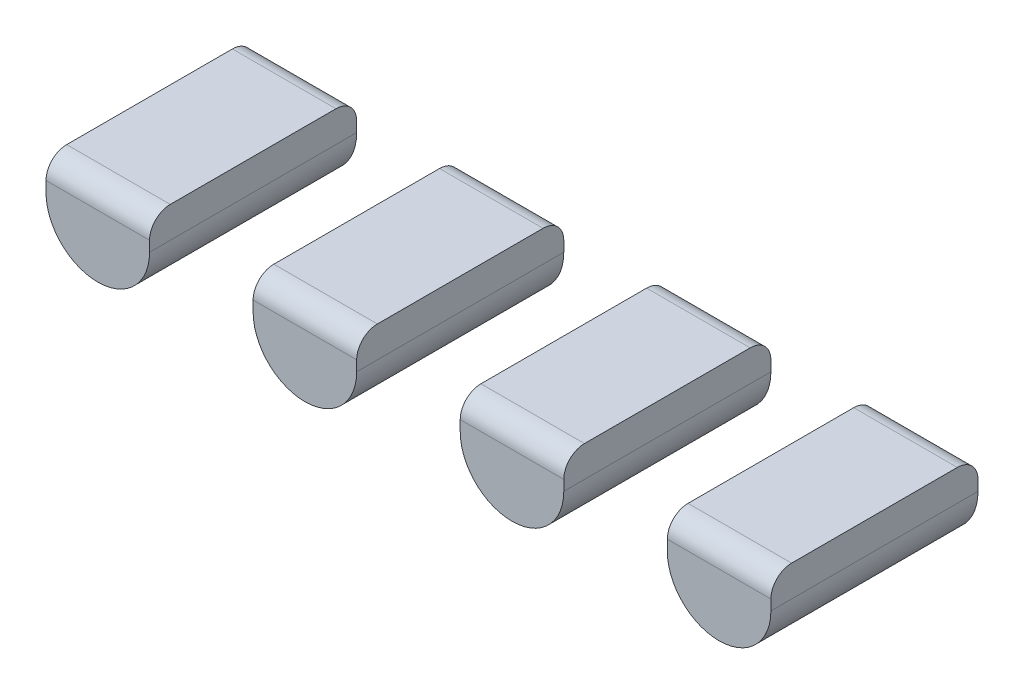
ISO-10303-21;
HEADER;
FILE_DESCRIPTION(('STEP AP214'),'2;1');
FILE_NAME('part.step','',(''),(''),'','','');
FILE_SCHEMA(('AUTOMOTIVE_DESIGN { 1 0 10303 214 1 1 1 1 }'));
ENDSEC;
DATA;
#1=APPLICATION_CONTEXT('core data for automotive mechanical design processes');
#2=APPLICATION_PROTOCOL_DEFINITION('international standard','automotive_design',2000,#1);
#3=PRODUCT_CONTEXT('',#1,'mechanical');
#4=PRODUCT('Part','Part','',(#3));
#5=PRODUCT_RELATED_PRODUCT_CATEGORY('part','',(#4));
#6=PRODUCT_DEFINITION_FORMATION('','',#4);
#7=PRODUCT_DEFINITION_CONTEXT('part definition',#1,'design');
#8=PRODUCT_DEFINITION('design','',#6,#7);
#9=PRODUCT_DEFINITION_SHAPE('','',#8);
#10=(LENGTH_UNIT() NAMED_UNIT(*) SI_UNIT(.MILLI.,.METRE.));
#11=(NAMED_UNIT(*) PLANE_ANGLE_UNIT() SI_UNIT($,.RADIAN.));
#12=(NAMED_UNIT(*) SI_UNIT($,.STERADIAN.) SOLID_ANGLE_UNIT());
#13=UNCERTAINTY_MEASURE_WITH_UNIT(LENGTH_MEASURE(1.E-05),#10,'distance_accuracy_value','');
#14=(GEOMETRIC_REPRESENTATION_CONTEXT(3) GLOBAL_UNCERTAINTY_ASSIGNED_CONTEXT((#13)) GLOBAL_UNIT_ASSIGNED_CONTEXT((#10,
#11,#12)) REPRESENTATION_CONTEXT('',''));
#15=CARTESIAN_POINT('',(0.,0.,0.));
#16=DIRECTION('',(0.,0.,1.));
#17=DIRECTION('',(1.,0.,0.));
#18=AXIS2_PLACEMENT_3D('',#15,#16,#17);
#19=CARTESIAN_POINT('',(0.125,0.51,0.));
#20=DIRECTION('',(0.,1.,0.));
#21=DIRECTION('',(-1.,0.,0.));
#22=AXIS2_PLACEMENT_3D('',#19,#20,#21);
#23=PLANE('',#22);
#24=DIRECTION('',(0.,0.,1.));
#25=VECTOR('',#24,1.);
#26=CARTESIAN_POINT('',(0.375,0.51,0.));
#27=LINE('',#26,#25);
#28=CARTESIAN_POINT('',(0.375,0.51,0.05));
#29=VERTEX_POINT('',#28);
#30=CARTESIAN_POINT('',(0.375,0.51,0.45));
#31=VERTEX_POINT('',#30);
#32=EDGE_CURVE('P0_E69',#29,#31,#27,.T.);
#33=ORIENTED_EDGE('',*,*,#32,.F.);
#34=DIRECTION('',(1.,0.,0.));
#35=VECTOR('',#34,1.);
#36=CARTESIAN_POINT('',(0.125,0.51,0.05));
#37=LINE('',#36,#35);
#38=CARTESIAN_POINT('',(0.125,0.51,0.05));
#39=VERTEX_POINT('',#38);
#40=EDGE_CURVE('P0_E77',#39,#29,#37,.T.);
#41=ORIENTED_EDGE('',*,*,#40,.F.);
#42=DIRECTION('',(0.,0.,1.));
#43=VECTOR('',#42,1.);
#44=CARTESIAN_POINT('',(0.125,0.51,0.));
#45=LINE('',#44,#43);
#46=CARTESIAN_POINT('',(0.125,0.51,0.45));
#47=VERTEX_POINT('',#46);
#48=EDGE_CURVE('P0_E72',#47,#39,#45,.F.);
#49=ORIENTED_EDGE('',*,*,#48,.F.);
#50=DIRECTION('',(1.,0.,0.));
#51=VECTOR('',#50,1.);
#52=CARTESIAN_POINT('',(0.125,0.51,0.45));
#53=LINE('',#52,#51);
#54=EDGE_CURVE('P0_E66',#31,#47,#53,.F.);
#55=ORIENTED_EDGE('',*,*,#54,.F.);
#56=EDGE_LOOP('',(#33,#41,#49,#55));
#57=FACE_BOUND('',#56,.T.);
#58=ADVANCED_FACE('P0_F17',(#57),#23,.T.);
#59=CARTESIAN_POINT('',(0.125,0.46,0.05));
#60=DIRECTION('',(1.,0.,0.));
#61=DIRECTION('',(0.,1.,0.));
#62=AXIS2_PLACEMENT_3D('',#59,#60,#61);
#63=CYLINDRICAL_SURFACE('',#62,0.05);
#64=DIRECTION('',(-1.,0.,0.));
#65=VECTOR('',#64,1.);
#66=CARTESIAN_POINT('',(0.125,0.46,0.));
#67=LINE('',#66,#65);
#68=CARTESIAN_POINT('',(0.125,0.46,0.));
#69=VERTEX_POINT('',#68);
#70=CARTESIAN_POINT('',(0.375,0.46,0.));
#71=VERTEX_POINT('',#70);
#72=EDGE_CURVE('P0_E76',#69,#71,#67,.F.);
#73=ORIENTED_EDGE('',*,*,#72,.F.);
#74=CARTESIAN_POINT('',(0.125,0.46,0.05));
#75=DIRECTION('',(1.,0.,0.));
#76=DIRECTION('',(0.,1.,0.));
#77=AXIS2_PLACEMENT_3D('',#74,#75,#76);
#78=CIRCLE('',#77,0.05);
#79=EDGE_CURVE('P0_E106',#39,#69,#78,.F.);
#80=ORIENTED_EDGE('',*,*,#79,.F.);
#81=ORIENTED_EDGE('',*,*,#40,.T.);
#82=CARTESIAN_POINT('',(0.375,0.46,0.05));
#83=DIRECTION('',(1.,0.,0.));
#84=DIRECTION('',(0.,1.,0.));
#85=AXIS2_PLACEMENT_3D('',#82,#83,#84);
#86=CIRCLE('',#85,0.05);
#87=EDGE_CURVE('P0_E90',#71,#29,#86,.T.);
#88=ORIENTED_EDGE('',*,*,#87,.F.);
#89=EDGE_LOOP('',(#73,#80,#81,#88));
#90=FACE_BOUND('',#89,.T.);
#91=ADVANCED_FACE('P0_F118',(#90),#63,.T.);
#92=CARTESIAN_POINT('',(0.125,0.46,0.45));
#93=DIRECTION('',(1.,0.,0.));
#94=DIRECTION('',(0.,1.,0.));
#95=AXIS2_PLACEMENT_3D('',#92,#93,#94);
#96=CYLINDRICAL_SURFACE('',#95,0.05);
#97=CARTESIAN_POINT('',(0.375,0.46,0.45));
#98=DIRECTION('',(1.,0.,0.));
#99=DIRECTION('',(0.,1.,0.));
#100=AXIS2_PLACEMENT_3D('',#97,#98,#99);
#101=CIRCLE('',#100,0.05);
#102=CARTESIAN_POINT('',(0.375,0.46,0.5));
#103=VERTEX_POINT('',#102);
#104=EDGE_CURVE('P0_E20',#31,#103,#101,.T.);
#105=ORIENTED_EDGE('',*,*,#104,.F.);
#106=ORIENTED_EDGE('',*,*,#54,.T.);
#107=CARTESIAN_POINT('',(0.125,0.46,0.45));
#108=DIRECTION('',(1.,0.,0.));
#109=DIRECTION('',(0.,1.,0.));
#110=AXIS2_PLACEMENT_3D('',#107,#108,#109);
#111=CIRCLE('',#110,0.05);
#112=CARTESIAN_POINT('',(0.125,0.46,0.5));
#113=VERTEX_POINT('',#112);
#114=EDGE_CURVE('P0_E104',#113,#47,#111,.F.);
#115=ORIENTED_EDGE('',*,*,#114,.F.);
#116=DIRECTION('',(-1.,0.,0.));
#117=VECTOR('',#116,1.);
#118=CARTESIAN_POINT('',(0.125,0.46,0.5));
#119=LINE('',#118,#117);
#120=EDGE_CURVE('P0_E82',#113,#103,#119,.F.);
#121=ORIENTED_EDGE('',*,*,#120,.T.);
#122=EDGE_LOOP('',(#105,#106,#115,#121));
#123=FACE_BOUND('',#122,.T.);
#124=ADVANCED_FACE('P0_F81',(#123),#96,.T.);
#125=CARTESIAN_POINT('',(0.125,0.435,0.));
#126=DIRECTION('',(0.,0.,-1.));
#127=DIRECTION('',(-1.,0.,0.));
#128=AXIS2_PLACEMENT_3D('',#125,#126,#127);
#129=PLANE('',#128);
#130=DIRECTION('',(0.,-1.,0.));
#131=VECTOR('',#130,1.);
#132=CARTESIAN_POINT('',(0.125,0.435,0.));
#133=LINE('',#132,#131);
#134=CARTESIAN_POINT('',(0.125,0.435,0.));
#135=VERTEX_POINT('',#134);
#136=EDGE_CURVE('P0_E108',#69,#135,#133,.T.);
#137=ORIENTED_EDGE('',*,*,#136,.F.);
#138=ORIENTED_EDGE('',*,*,#72,.T.);
#139=DIRECTION('',(0.,1.,0.));
#140=VECTOR('',#139,1.);
#141=CARTESIAN_POINT('',(0.375,0.51,0.));
#142=LINE('',#141,#140);
#143=CARTESIAN_POINT('',(0.375,0.435,0.));
#144=VERTEX_POINT('',#143);
#145=EDGE_CURVE('P0_E85',#144,#71,#142,.T.);
#146=ORIENTED_EDGE('',*,*,#145,.F.);
#147=CARTESIAN_POINT('',(0.25,0.435,0.));
#148=DIRECTION('',(0.,0.,-1.));
#149=DIRECTION('',(-1.,0.,0.));
#150=AXIS2_PLACEMENT_3D('',#147,#148,#149);
#151=CIRCLE('',#150,0.125);
#152=EDGE_CURVE('P0_E101',#135,#144,#151,.F.);
#153=ORIENTED_EDGE('',*,*,#152,.F.);
#154=EDGE_LOOP('',(#137,#138,#146,#153));
#155=FACE_BOUND('',#154,.T.);
#156=ADVANCED_FACE('P0_F114',(#155),#129,.T.);
#157=CARTESIAN_POINT('',(0.375,0.51,0.));
#158=DIRECTION('',(1.,0.,0.));
#159=DIRECTION('',(0.,1.,0.));
#160=AXIS2_PLACEMENT_3D('',#157,#158,#159);
#161=PLANE('',#160);
#162=ORIENTED_EDGE('',*,*,#145,.T.);
#163=ORIENTED_EDGE('',*,*,#87,.T.);
#164=ORIENTED_EDGE('',*,*,#32,.T.);
#165=ORIENTED_EDGE('',*,*,#104,.T.);
#166=DIRECTION('',(0.,1.,0.));
#167=VECTOR('',#166,1.);
#168=CARTESIAN_POINT('',(0.375,0.435,0.5));
#169=LINE('',#168,#167);
#170=CARTESIAN_POINT('',(0.375,0.435,0.5));
#171=VERTEX_POINT('',#170);
#172=EDGE_CURVE('P0_E95',#103,#171,#169,.F.);
#173=ORIENTED_EDGE('',*,*,#172,.T.);
#174=DIRECTION('',(0.,0.,-1.));
#175=VECTOR('',#174,1.);
#176=CARTESIAN_POINT('',(0.375,0.435,0.));
#177=LINE('',#176,#175);
#178=EDGE_CURVE('P0_E100',#144,#171,#177,.F.);
#179=ORIENTED_EDGE('',*,*,#178,.F.);
#180=EDGE_LOOP('',(#162,#163,#164,#165,#173,#179));
#181=FACE_BOUND('',#180,.T.);
#182=ADVANCED_FACE('P0_F88',(#181),#161,.T.);
#183=CARTESIAN_POINT('',(0.125,0.435,0.5));
#184=DIRECTION('',(0.,0.,-1.));
#185=DIRECTION('',(-1.,0.,0.));
#186=AXIS2_PLACEMENT_3D('',#183,#184,#185);
#187=PLANE('',#186);
#188=DIRECTION('',(0.,-1.,0.));
#189=VECTOR('',#188,1.);
#190=CARTESIAN_POINT('',(0.125,0.435,0.5));
#191=LINE('',#190,#189);
#192=CARTESIAN_POINT('',(0.125,0.435,0.5));
#193=VERTEX_POINT('',#192);
#194=EDGE_CURVE('P0_E35',#193,#113,#191,.F.);
#195=ORIENTED_EDGE('',*,*,#194,.F.);
#196=CARTESIAN_POINT('',(0.25,0.435,0.5));
#197=DIRECTION('',(0.,0.,-1.));
#198=DIRECTION('',(-1.,0.,0.));
#199=AXIS2_PLACEMENT_3D('',#196,#197,#198);
#200=CIRCLE('',#199,0.125);
#201=EDGE_CURVE('P0_E26',#171,#193,#200,.T.);
#202=ORIENTED_EDGE('',*,*,#201,.F.);
#203=ORIENTED_EDGE('',*,*,#172,.F.);
#204=ORIENTED_EDGE('',*,*,#120,.F.);
#205=EDGE_LOOP('',(#195,#202,#203,#204));
#206=FACE_BOUND('',#205,.T.);
#207=ADVANCED_FACE('P0_F127',(#206),#187,.F.);
#208=CARTESIAN_POINT('',(0.125,0.435,0.));
#209=DIRECTION('',(-1.,0.,0.));
#210=DIRECTION('',(0.,-1.,0.));
#211=AXIS2_PLACEMENT_3D('',#208,#209,#210);
#212=PLANE('',#211);
#213=ORIENTED_EDGE('',*,*,#194,.T.);
#214=ORIENTED_EDGE('',*,*,#114,.T.);
#215=ORIENTED_EDGE('',*,*,#48,.T.);
#216=ORIENTED_EDGE('',*,*,#79,.T.);
#217=ORIENTED_EDGE('',*,*,#136,.T.);
#218=DIRECTION('',(0.,0.,-1.));
#219=VECTOR('',#218,1.);
#220=CARTESIAN_POINT('',(0.125,0.435,0.));
#221=LINE('',#220,#219);
#222=EDGE_CURVE('P0_E11',#193,#135,#221,.T.);
#223=ORIENTED_EDGE('',*,*,#222,.F.);
#224=EDGE_LOOP('',(#213,#214,#215,#216,#217,#223));
#225=FACE_BOUND('',#224,.T.);
#226=ADVANCED_FACE('P0_F120',(#225),#212,.T.);
#227=CARTESIAN_POINT('',(0.25,0.435,0.));
#228=DIRECTION('',(0.,0.,-1.));
#229=DIRECTION('',(-1.,0.,0.));
#230=AXIS2_PLACEMENT_3D('',#227,#228,#229);
#231=CYLINDRICAL_SURFACE('',#230,0.125);
#232=ORIENTED_EDGE('',*,*,#201,.T.);
#233=ORIENTED_EDGE('',*,*,#222,.T.);
#234=ORIENTED_EDGE('',*,*,#152,.T.);
#235=ORIENTED_EDGE('',*,*,#178,.T.);
#236=EDGE_LOOP('',(#232,#233,#234,#235));
#237=FACE_BOUND('',#236,.T.);
#238=ADVANCED_FACE('P0_F126',(#237),#231,.T.);
#239=CLOSED_SHELL('',(#58,#91,#124,#156,#182,#207,#226,#238));
#240=MANIFOLD_SOLID_BREP('P0_B1',#239);
#241=CARTESIAN_POINT('',(-0.375,0.51,0.));
#242=DIRECTION('',(0.,1.,0.));
#243=DIRECTION('',(-1.,0.,0.));
#244=AXIS2_PLACEMENT_3D('',#241,#242,#243);
#245=PLANE('',#244);
#246=DIRECTION('',(0.,0.,1.));
#247=VECTOR('',#246,1.);
#248=CARTESIAN_POINT('',(-0.125,0.51,0.));
#249=LINE('',#248,#247);
#250=CARTESIAN_POINT('',(-0.125,0.51,0.05));
#251=VERTEX_POINT('',#250);
#252=CARTESIAN_POINT('',(-0.125,0.51,0.45));
#253=VERTEX_POINT('',#252);
#254=EDGE_CURVE('P1_E69',#251,#253,#249,.T.);
#255=ORIENTED_EDGE('',*,*,#254,.F.);
#256=DIRECTION('',(1.,0.,0.));
#257=VECTOR('',#256,1.);
#258=CARTESIAN_POINT('',(-0.375,0.51,0.05));
#259=LINE('',#258,#257);
#260=CARTESIAN_POINT('',(-0.375,0.51,0.05));
#261=VERTEX_POINT('',#260);
#262=EDGE_CURVE('P1_E77',#261,#251,#259,.T.);
#263=ORIENTED_EDGE('',*,*,#262,.F.);
#264=DIRECTION('',(0.,0.,1.));
#265=VECTOR('',#264,1.);
#266=CARTESIAN_POINT('',(-0.375,0.51,0.));
#267=LINE('',#266,#265);
#268=CARTESIAN_POINT('',(-0.375,0.51,0.45));
#269=VERTEX_POINT('',#268);
#270=EDGE_CURVE('P1_E72',#269,#261,#267,.F.);
#271=ORIENTED_EDGE('',*,*,#270,.F.);
#272=DIRECTION('',(1.,0.,0.));
#273=VECTOR('',#272,1.);
#274=CARTESIAN_POINT('',(-0.375,0.51,0.45));
#275=LINE('',#274,#273);
#276=EDGE_CURVE('P1_E66',#253,#269,#275,.F.);
#277=ORIENTED_EDGE('',*,*,#276,.F.);
#278=EDGE_LOOP('',(#255,#263,#271,#277));
#279=FACE_BOUND('',#278,.T.);
#280=ADVANCED_FACE('P1_F17',(#279),#245,.T.);
#281=CARTESIAN_POINT('',(-0.375,0.46,0.05));
#282=DIRECTION('',(1.,0.,0.));
#283=DIRECTION('',(0.,1.,0.));
#284=AXIS2_PLACEMENT_3D('',#281,#282,#283);
#285=CYLINDRICAL_SURFACE('',#284,0.05);
#286=DIRECTION('',(-1.,0.,0.));
#287=VECTOR('',#286,1.);
#288=CARTESIAN_POINT('',(-0.375,0.46,0.));
#289=LINE('',#288,#287);
#290=CARTESIAN_POINT('',(-0.375,0.46,0.));
#291=VERTEX_POINT('',#290);
#292=CARTESIAN_POINT('',(-0.125,0.46,0.));
#293=VERTEX_POINT('',#292);
#294=EDGE_CURVE('P1_E76',#291,#293,#289,.F.);
#295=ORIENTED_EDGE('',*,*,#294,.F.);
#296=CARTESIAN_POINT('',(-0.375,0.46,0.05));
#297=DIRECTION('',(1.,0.,0.));
#298=DIRECTION('',(0.,1.,0.));
#299=AXIS2_PLACEMENT_3D('',#296,#297,#298);
#300=CIRCLE('',#299,0.05);
#301=EDGE_CURVE('P1_E106',#261,#291,#300,.F.);
#302=ORIENTED_EDGE('',*,*,#301,.F.);
#303=ORIENTED_EDGE('',*,*,#262,.T.);
#304=CARTESIAN_POINT('',(-0.125,0.46,0.05));
#305=DIRECTION('',(1.,0.,0.));
#306=DIRECTION('',(0.,1.,0.));
#307=AXIS2_PLACEMENT_3D('',#304,#305,#306);
#308=CIRCLE('',#307,0.05);
#309=EDGE_CURVE('P1_E90',#293,#251,#308,.T.);
#310=ORIENTED_EDGE('',*,*,#309,.F.);
#311=EDGE_LOOP('',(#295,#302,#303,#310));
#312=FACE_BOUND('',#311,.T.);
#313=ADVANCED_FACE('P1_F118',(#312),#285,.T.);
#314=CARTESIAN_POINT('',(-0.375,0.46,0.45));
#315=DIRECTION('',(1.,0.,0.));
#316=DIRECTION('',(0.,1.,0.));
#317=AXIS2_PLACEMENT_3D('',#314,#315,#316);
#318=CYLINDRICAL_SURFACE('',#317,0.05);
#319=CARTESIAN_POINT('',(-0.125,0.46,0.45));
#320=DIRECTION('',(1.,0.,0.));
#321=DIRECTION('',(0.,1.,0.));
#322=AXIS2_PLACEMENT_3D('',#319,#320,#321);
#323=CIRCLE('',#322,0.05);
#324=CARTESIAN_POINT('',(-0.125,0.46,0.5));
#325=VERTEX_POINT('',#324);
#326=EDGE_CURVE('P1_E20',#253,#325,#323,.T.);
#327=ORIENTED_EDGE('',*,*,#326,.F.);
#328=ORIENTED_EDGE('',*,*,#276,.T.);
#329=CARTESIAN_POINT('',(-0.375,0.46,0.45));
#330=DIRECTION('',(1.,0.,0.));
#331=DIRECTION('',(0.,1.,0.));
#332=AXIS2_PLACEMENT_3D('',#329,#330,#331);
#333=CIRCLE('',#332,0.05);
#334=CARTESIAN_POINT('',(-0.375,0.46,0.5));
#335=VERTEX_POINT('',#334);
#336=EDGE_CURVE('P1_E104',#335,#269,#333,.F.);
#337=ORIENTED_EDGE('',*,*,#336,.F.);
#338=DIRECTION('',(-1.,0.,0.));
#339=VECTOR('',#338,1.);
#340=CARTESIAN_POINT('',(-0.375,0.46,0.5));
#341=LINE('',#340,#339);
#342=EDGE_CURVE('P1_E82',#335,#325,#341,.F.);
#343=ORIENTED_EDGE('',*,*,#342,.T.);
#344=EDGE_LOOP('',(#327,#328,#337,#343));
#345=FACE_BOUND('',#344,.T.);
#346=ADVANCED_FACE('P1_F81',(#345),#318,.T.);
#347=CARTESIAN_POINT('',(-0.375,0.435,0.));
#348=DIRECTION('',(0.,0.,-1.));
#349=DIRECTION('',(-1.,0.,0.));
#350=AXIS2_PLACEMENT_3D('',#347,#348,#349);
#351=PLANE('',#350);
#352=DIRECTION('',(0.,-1.,0.));
#353=VECTOR('',#352,1.);
#354=CARTESIAN_POINT('',(-0.375,0.435,0.));
#355=LINE('',#354,#353);
#356=CARTESIAN_POINT('',(-0.375,0.435,0.));
#357=VERTEX_POINT('',#356);
#358=EDGE_CURVE('P1_E108',#291,#357,#355,.T.);
#359=ORIENTED_EDGE('',*,*,#358,.F.);
#360=ORIENTED_EDGE('',*,*,#294,.T.);
#361=DIRECTION('',(0.,1.,0.));
#362=VECTOR('',#361,1.);
#363=CARTESIAN_POINT('',(-0.125,0.51,0.));
#364=LINE('',#363,#362);
#365=CARTESIAN_POINT('',(-0.125,0.435,0.));
#366=VERTEX_POINT('',#365);
#367=EDGE_CURVE('P1_E85',#366,#293,#364,.T.);
#368=ORIENTED_EDGE('',*,*,#367,.F.);
#369=CARTESIAN_POINT('',(-0.25,0.435,0.));
#370=DIRECTION('',(0.,0.,-1.));
#371=DIRECTION('',(-1.,0.,0.));
#372=AXIS2_PLACEMENT_3D('',#369,#370,#371);
#373=CIRCLE('',#372,0.125);
#374=EDGE_CURVE('P1_E101',#357,#366,#373,.F.);
#375=ORIENTED_EDGE('',*,*,#374,.F.);
#376=EDGE_LOOP('',(#359,#360,#368,#375));
#377=FACE_BOUND('',#376,.T.);
#378=ADVANCED_FACE('P1_F114',(#377),#351,.T.);
#379=CARTESIAN_POINT('',(-0.125,0.51,0.));
#380=DIRECTION('',(1.,0.,0.));
#381=DIRECTION('',(0.,1.,0.));
#382=AXIS2_PLACEMENT_3D('',#379,#380,#381);
#383=PLANE('',#382);
#384=ORIENTED_EDGE('',*,*,#367,.T.);
#385=ORIENTED_EDGE('',*,*,#309,.T.);
#386=ORIENTED_EDGE('',*,*,#254,.T.);
#387=ORIENTED_EDGE('',*,*,#326,.T.);
#388=DIRECTION('',(0.,1.,0.));
#389=VECTOR('',#388,1.);
#390=CARTESIAN_POINT('',(-0.125,0.435,0.5));
#391=LINE('',#390,#389);
#392=CARTESIAN_POINT('',(-0.125,0.435,0.5));
#393=VERTEX_POINT('',#392);
#394=EDGE_CURVE('P1_E95',#325,#393,#391,.F.);
#395=ORIENTED_EDGE('',*,*,#394,.T.);
#396=DIRECTION('',(0.,0.,-1.));
#397=VECTOR('',#396,1.);
#398=CARTESIAN_POINT('',(-0.125,0.435,0.));
#399=LINE('',#398,#397);
#400=EDGE_CURVE('P1_E100',#366,#393,#399,.F.);
#401=ORIENTED_EDGE('',*,*,#400,.F.);
#402=EDGE_LOOP('',(#384,#385,#386,#387,#395,#401));
#403=FACE_BOUND('',#402,.T.);
#404=ADVANCED_FACE('P1_F88',(#403),#383,.T.);
#405=CARTESIAN_POINT('',(-0.375,0.435,0.5));
#406=DIRECTION('',(0.,0.,-1.));
#407=DIRECTION('',(-1.,0.,0.));
#408=AXIS2_PLACEMENT_3D('',#405,#406,#407);
#409=PLANE('',#408);
#410=DIRECTION('',(0.,-1.,0.));
#411=VECTOR('',#410,1.);
#412=CARTESIAN_POINT('',(-0.375,0.435,0.5));
#413=LINE('',#412,#411);
#414=CARTESIAN_POINT('',(-0.375,0.435,0.5));
#415=VERTEX_POINT('',#414);
#416=EDGE_CURVE('P1_E35',#415,#335,#413,.F.);
#417=ORIENTED_EDGE('',*,*,#416,.F.);
#418=CARTESIAN_POINT('',(-0.25,0.435,0.5));
#419=DIRECTION('',(0.,0.,-1.));
#420=DIRECTION('',(-1.,0.,0.));
#421=AXIS2_PLACEMENT_3D('',#418,#419,#420);
#422=CIRCLE('',#421,0.125);
#423=EDGE_CURVE('P1_E26',#393,#415,#422,.T.);
#424=ORIENTED_EDGE('',*,*,#423,.F.);
#425=ORIENTED_EDGE('',*,*,#394,.F.);
#426=ORIENTED_EDGE('',*,*,#342,.F.);
#427=EDGE_LOOP('',(#417,#424,#425,#426));
#428=FACE_BOUND('',#427,.T.);
#429=ADVANCED_FACE('P1_F127',(#428),#409,.F.);
#430=CARTESIAN_POINT('',(-0.375,0.435,0.));
#431=DIRECTION('',(-1.,0.,0.));
#432=DIRECTION('',(0.,-1.,0.));
#433=AXIS2_PLACEMENT_3D('',#430,#431,#432);
#434=PLANE('',#433);
#435=ORIENTED_EDGE('',*,*,#416,.T.);
#436=ORIENTED_EDGE('',*,*,#336,.T.);
#437=ORIENTED_EDGE('',*,*,#270,.T.);
#438=ORIENTED_EDGE('',*,*,#301,.T.);
#439=ORIENTED_EDGE('',*,*,#358,.T.);
#440=DIRECTION('',(0.,0.,-1.));
#441=VECTOR('',#440,1.);
#442=CARTESIAN_POINT('',(-0.375,0.435,0.));
#443=LINE('',#442,#441);
#444=EDGE_CURVE('P1_E11',#415,#357,#443,.T.);
#445=ORIENTED_EDGE('',*,*,#444,.F.);
#446=EDGE_LOOP('',(#435,#436,#437,#438,#439,#445));
#447=FACE_BOUND('',#446,.T.);
#448=ADVANCED_FACE('P1_F120',(#447),#434,.T.);
#449=CARTESIAN_POINT('',(-0.25,0.435,0.));
#450=DIRECTION('',(0.,0.,-1.));
#451=DIRECTION('',(-1.,0.,0.));
#452=AXIS2_PLACEMENT_3D('',#449,#450,#451);
#453=CYLINDRICAL_SURFACE('',#452,0.125);
#454=ORIENTED_EDGE('',*,*,#423,.T.);
#455=ORIENTED_EDGE('',*,*,#444,.T.);
#456=ORIENTED_EDGE('',*,*,#374,.T.);
#457=ORIENTED_EDGE('',*,*,#400,.T.);
#458=EDGE_LOOP('',(#454,#455,#456,#457));
#459=FACE_BOUND('',#458,.T.);
#460=ADVANCED_FACE('P1_F126',(#459),#453,.T.);
#461=CLOSED_SHELL('',(#280,#313,#346,#378,#404,#429,#448,#460));
#462=MANIFOLD_SOLID_BREP('P1_B1',#461);
#463=CARTESIAN_POINT('',(0.625,0.51,0.));
#464=DIRECTION('',(0.,1.,0.));
#465=DIRECTION('',(-1.,0.,0.));
#466=AXIS2_PLACEMENT_3D('',#463,#464,#465);
#467=PLANE('',#466);
#468=DIRECTION('',(0.,0.,1.));
#469=VECTOR('',#468,1.);
#470=CARTESIAN_POINT('',(0.875,0.51,0.));
#471=LINE('',#470,#469);
#472=CARTESIAN_POINT('',(0.875,0.51,0.05));
#473=VERTEX_POINT('',#472);
#474=CARTESIAN_POINT('',(0.875,0.51,0.45));
#475=VERTEX_POINT('',#474);
#476=EDGE_CURVE('P2_E69',#473,#475,#471,.T.);
#477=ORIENTED_EDGE('',*,*,#476,.F.);
#478=DIRECTION('',(1.,0.,0.));
#479=VECTOR('',#478,1.);
#480=CARTESIAN_POINT('',(0.625,0.51,0.05));
#481=LINE('',#480,#479);
#482=CARTESIAN_POINT('',(0.625,0.51,0.05));
#483=VERTEX_POINT('',#482);
#484=EDGE_CURVE('P2_E77',#483,#473,#481,.T.);
#485=ORIENTED_EDGE('',*,*,#484,.F.);
#486=DIRECTION('',(0.,0.,1.));
#487=VECTOR('',#486,1.);
#488=CARTESIAN_POINT('',(0.625,0.51,0.));
#489=LINE('',#488,#487);
#490=CARTESIAN_POINT('',(0.625,0.51,0.45));
#491=VERTEX_POINT('',#490);
#492=EDGE_CURVE('P2_E72',#491,#483,#489,.F.);
#493=ORIENTED_EDGE('',*,*,#492,.F.);
#494=DIRECTION('',(1.,0.,0.));
#495=VECTOR('',#494,1.);
#496=CARTESIAN_POINT('',(0.625,0.51,0.45));
#497=LINE('',#496,#495);
#498=EDGE_CURVE('P2_E66',#475,#491,#497,.F.);
#499=ORIENTED_EDGE('',*,*,#498,.F.);
#500=EDGE_LOOP('',(#477,#485,#493,#499));
#501=FACE_BOUND('',#500,.T.);
#502=ADVANCED_FACE('P2_F17',(#501),#467,.T.);
#503=CARTESIAN_POINT('',(0.625,0.46,0.05));
#504=DIRECTION('',(1.,0.,0.));
#505=DIRECTION('',(0.,1.,0.));
#506=AXIS2_PLACEMENT_3D('',#503,#504,#505);
#507=CYLINDRICAL_SURFACE('',#506,0.05);
#508=DIRECTION('',(-1.,0.,0.));
#509=VECTOR('',#508,1.);
#510=CARTESIAN_POINT('',(0.625,0.46,0.));
#511=LINE('',#510,#509);
#512=CARTESIAN_POINT('',(0.625,0.46,0.));
#513=VERTEX_POINT('',#512);
#514=CARTESIAN_POINT('',(0.875,0.46,0.));
#515=VERTEX_POINT('',#514);
#516=EDGE_CURVE('P2_E76',#513,#515,#511,.F.);
#517=ORIENTED_EDGE('',*,*,#516,.F.);
#518=CARTESIAN_POINT('',(0.625,0.46,0.05));
#519=DIRECTION('',(1.,0.,0.));
#520=DIRECTION('',(0.,1.,0.));
#521=AXIS2_PLACEMENT_3D('',#518,#519,#520);
#522=CIRCLE('',#521,0.05);
#523=EDGE_CURVE('P2_E106',#483,#513,#522,.F.);
#524=ORIENTED_EDGE('',*,*,#523,.F.);
#525=ORIENTED_EDGE('',*,*,#484,.T.);
#526=CARTESIAN_POINT('',(0.875,0.46,0.05));
#527=DIRECTION('',(1.,0.,0.));
#528=DIRECTION('',(0.,1.,0.));
#529=AXIS2_PLACEMENT_3D('',#526,#527,#528);
#530=CIRCLE('',#529,0.05);
#531=EDGE_CURVE('P2_E90',#515,#473,#530,.T.);
#532=ORIENTED_EDGE('',*,*,#531,.F.);
#533=EDGE_LOOP('',(#517,#524,#525,#532));
#534=FACE_BOUND('',#533,.T.);
#535=ADVANCED_FACE('P2_F118',(#534),#507,.T.);
#536=CARTESIAN_POINT('',(0.625,0.46,0.45));
#537=DIRECTION('',(1.,0.,0.));
#538=DIRECTION('',(0.,1.,0.));
#539=AXIS2_PLACEMENT_3D('',#536,#537,#538);
#540=CYLINDRICAL_SURFACE('',#539,0.05);
#541=CARTESIAN_POINT('',(0.875,0.46,0.45));
#542=DIRECTION('',(1.,0.,0.));
#543=DIRECTION('',(0.,1.,0.));
#544=AXIS2_PLACEMENT_3D('',#541,#542,#543);
#545=CIRCLE('',#544,0.05);
#546=CARTESIAN_POINT('',(0.875,0.46,0.5));
#547=VERTEX_POINT('',#546);
#548=EDGE_CURVE('P2_E20',#475,#547,#545,.T.);
#549=ORIENTED_EDGE('',*,*,#548,.F.);
#550=ORIENTED_EDGE('',*,*,#498,.T.);
#551=CARTESIAN_POINT('',(0.625,0.46,0.45));
#552=DIRECTION('',(1.,0.,0.));
#553=DIRECTION('',(0.,1.,0.));
#554=AXIS2_PLACEMENT_3D('',#551,#552,#553);
#555=CIRCLE('',#554,0.05);
#556=CARTESIAN_POINT('',(0.625,0.46,0.5));
#557=VERTEX_POINT('',#556);
#558=EDGE_CURVE('P2_E104',#557,#491,#555,.F.);
#559=ORIENTED_EDGE('',*,*,#558,.F.);
#560=DIRECTION('',(-1.,0.,0.));
#561=VECTOR('',#560,1.);
#562=CARTESIAN_POINT('',(0.625,0.46,0.5));
#563=LINE('',#562,#561);
#564=EDGE_CURVE('P2_E82',#557,#547,#563,.F.);
#565=ORIENTED_EDGE('',*,*,#564,.T.);
#566=EDGE_LOOP('',(#549,#550,#559,#565));
#567=FACE_BOUND('',#566,.T.);
#568=ADVANCED_FACE('P2_F81',(#567),#540,.T.);
#569=CARTESIAN_POINT('',(0.625,0.435,0.));
#570=DIRECTION('',(0.,0.,-1.));
#571=DIRECTION('',(-1.,0.,0.));
#572=AXIS2_PLACEMENT_3D('',#569,#570,#571);
#573=PLANE('',#572);
#574=DIRECTION('',(0.,-1.,0.));
#575=VECTOR('',#574,1.);
#576=CARTESIAN_POINT('',(0.625,0.435,0.));
#577=LINE('',#576,#575);
#578=CARTESIAN_POINT('',(0.625,0.435,0.));
#579=VERTEX_POINT('',#578);
#580=EDGE_CURVE('P2_E108',#513,#579,#577,.T.);
#581=ORIENTED_EDGE('',*,*,#580,.F.);
#582=ORIENTED_EDGE('',*,*,#516,.T.);
#583=DIRECTION('',(0.,1.,0.));
#584=VECTOR('',#583,1.);
#585=CARTESIAN_POINT('',(0.875,0.51,0.));
#586=LINE('',#585,#584);
#587=CARTESIAN_POINT('',(0.875,0.435,0.));
#588=VERTEX_POINT('',#587);
#589=EDGE_CURVE('P2_E85',#588,#515,#586,.T.);
#590=ORIENTED_EDGE('',*,*,#589,.F.);
#591=CARTESIAN_POINT('',(0.75,0.435,0.));
#592=DIRECTION('',(0.,0.,-1.));
#593=DIRECTION('',(-1.,0.,0.));
#594=AXIS2_PLACEMENT_3D('',#591,#592,#593);
#595=CIRCLE('',#594,0.125);
#596=EDGE_CURVE('P2_E101',#579,#588,#595,.F.);
#597=ORIENTED_EDGE('',*,*,#596,.F.);
#598=EDGE_LOOP('',(#581,#582,#590,#597));
#599=FACE_BOUND('',#598,.T.);
#600=ADVANCED_FACE('P2_F114',(#599),#573,.T.);
#601=CARTESIAN_POINT('',(0.875,0.51,0.));
#602=DIRECTION('',(1.,0.,0.));
#603=DIRECTION('',(0.,1.,0.));
#604=AXIS2_PLACEMENT_3D('',#601,#602,#603);
#605=PLANE('',#604);
#606=ORIENTED_EDGE('',*,*,#589,.T.);
#607=ORIENTED_EDGE('',*,*,#531,.T.);
#608=ORIENTED_EDGE('',*,*,#476,.T.);
#609=ORIENTED_EDGE('',*,*,#548,.T.);
#610=DIRECTION('',(0.,1.,0.));
#611=VECTOR('',#610,1.);
#612=CARTESIAN_POINT('',(0.875,0.435,0.5));
#613=LINE('',#612,#611);
#614=CARTESIAN_POINT('',(0.875,0.435,0.5));
#615=VERTEX_POINT('',#614);
#616=EDGE_CURVE('P2_E95',#547,#615,#613,.F.);
#617=ORIENTED_EDGE('',*,*,#616,.T.);
#618=DIRECTION('',(0.,0.,-1.));
#619=VECTOR('',#618,1.);
#620=CARTESIAN_POINT('',(0.875,0.435,0.));
#621=LINE('',#620,#619);
#622=EDGE_CURVE('P2_E100',#588,#615,#621,.F.);
#623=ORIENTED_EDGE('',*,*,#622,.F.);
#624=EDGE_LOOP('',(#606,#607,#608,#609,#617,#623));
#625=FACE_BOUND('',#624,.T.);
#626=ADVANCED_FACE('P2_F88',(#625),#605,.T.);
#627=CARTESIAN_POINT('',(0.625,0.435,0.5));
#628=DIRECTION('',(0.,0.,-1.));
#629=DIRECTION('',(-1.,0.,0.));
#630=AXIS2_PLACEMENT_3D('',#627,#628,#629);
#631=PLANE('',#630);
#632=DIRECTION('',(0.,-1.,0.));
#633=VECTOR('',#632,1.);
#634=CARTESIAN_POINT('',(0.625,0.435,0.5));
#635=LINE('',#634,#633);
#636=CARTESIAN_POINT('',(0.625,0.435,0.5));
#637=VERTEX_POINT('',#636);
#638=EDGE_CURVE('P2_E35',#637,#557,#635,.F.);
#639=ORIENTED_EDGE('',*,*,#638,.F.);
#640=CARTESIAN_POINT('',(0.75,0.435,0.5));
#641=DIRECTION('',(0.,0.,-1.));
#642=DIRECTION('',(-1.,0.,0.));
#643=AXIS2_PLACEMENT_3D('',#640,#641,#642);
#644=CIRCLE('',#643,0.125);
#645=EDGE_CURVE('P2_E26',#615,#637,#644,.T.);
#646=ORIENTED_EDGE('',*,*,#645,.F.);
#647=ORIENTED_EDGE('',*,*,#616,.F.);
#648=ORIENTED_EDGE('',*,*,#564,.F.);
#649=EDGE_LOOP('',(#639,#646,#647,#648));
#650=FACE_BOUND('',#649,.T.);
#651=ADVANCED_FACE('P2_F127',(#650),#631,.F.);
#652=CARTESIAN_POINT('',(0.625,0.435,0.));
#653=DIRECTION('',(-1.,0.,0.));
#654=DIRECTION('',(0.,-1.,0.));
#655=AXIS2_PLACEMENT_3D('',#652,#653,#654);
#656=PLANE('',#655);
#657=ORIENTED_EDGE('',*,*,#638,.T.);
#658=ORIENTED_EDGE('',*,*,#558,.T.);
#659=ORIENTED_EDGE('',*,*,#492,.T.);
#660=ORIENTED_EDGE('',*,*,#523,.T.);
#661=ORIENTED_EDGE('',*,*,#580,.T.);
#662=DIRECTION('',(0.,0.,-1.));
#663=VECTOR('',#662,1.);
#664=CARTESIAN_POINT('',(0.625,0.435,0.));
#665=LINE('',#664,#663);
#666=EDGE_CURVE('P2_E11',#637,#579,#665,.T.);
#667=ORIENTED_EDGE('',*,*,#666,.F.);
#668=EDGE_LOOP('',(#657,#658,#659,#660,#661,#667));
#669=FACE_BOUND('',#668,.T.);
#670=ADVANCED_FACE('P2_F120',(#669),#656,.T.);
#671=CARTESIAN_POINT('',(0.75,0.435,0.));
#672=DIRECTION('',(0.,0.,-1.));
#673=DIRECTION('',(-1.,0.,0.));
#674=AXIS2_PLACEMENT_3D('',#671,#672,#673);
#675=CYLINDRICAL_SURFACE('',#674,0.125);
#676=ORIENTED_EDGE('',*,*,#645,.T.);
#677=ORIENTED_EDGE('',*,*,#666,.T.);
#678=ORIENTED_EDGE('',*,*,#596,.T.);
#679=ORIENTED_EDGE('',*,*,#622,.T.);
#680=EDGE_LOOP('',(#676,#677,#678,#679));
#681=FACE_BOUND('',#680,.T.);
#682=ADVANCED_FACE('P2_F126',(#681),#675,.T.);
#683=CLOSED_SHELL('',(#502,#535,#568,#600,#626,#651,#670,#682));
#684=MANIFOLD_SOLID_BREP('P2_B1',#683);
#685=CARTESIAN_POINT('',(-0.875,0.51,0.));
#686=DIRECTION('',(0.,1.,0.));
#687=DIRECTION('',(-1.,0.,0.));
#688=AXIS2_PLACEMENT_3D('',#685,#686,#687);
#689=PLANE('',#688);
#690=DIRECTION('',(0.,0.,1.));
#691=VECTOR('',#690,1.);
#692=CARTESIAN_POINT('',(-0.625,0.51,0.));
#693=LINE('',#692,#691);
#694=CARTESIAN_POINT('',(-0.625,0.51,0.05));
#695=VERTEX_POINT('',#694);
#696=CARTESIAN_POINT('',(-0.625,0.51,0.45));
#697=VERTEX_POINT('',#696);
#698=EDGE_CURVE('P3_E68',#695,#697,#693,.T.);
#699=ORIENTED_EDGE('',*,*,#698,.F.);
#700=DIRECTION('',(1.,0.,0.));
#701=VECTOR('',#700,1.);
#702=CARTESIAN_POINT('',(-0.875,0.51,0.05));
#703=LINE('',#702,#701);
#704=CARTESIAN_POINT('',(-0.875,0.51,0.05));
#705=VERTEX_POINT('',#704);
#706=EDGE_CURVE('P3_E76',#705,#695,#703,.T.);
#707=ORIENTED_EDGE('',*,*,#706,.F.);
#708=DIRECTION('',(0.,0.,1.));
#709=VECTOR('',#708,1.);
#710=CARTESIAN_POINT('',(-0.875,0.51,0.));
#711=LINE('',#710,#709);
#712=CARTESIAN_POINT('',(-0.875,0.51,0.45));
#713=VERTEX_POINT('',#712);
#714=EDGE_CURVE('P3_E71',#713,#705,#711,.F.);
#715=ORIENTED_EDGE('',*,*,#714,.F.);
#716=DIRECTION('',(1.,0.,0.));
#717=VECTOR('',#716,1.);
#718=CARTESIAN_POINT('',(-0.875,0.51,0.45));
#719=LINE('',#718,#717);
#720=EDGE_CURVE('P3_E65',#697,#713,#719,.F.);
#721=ORIENTED_EDGE('',*,*,#720,.F.);
#722=EDGE_LOOP('',(#699,#707,#715,#721));
#723=FACE_BOUND('',#722,.T.);
#724=ADVANCED_FACE('P3_F16',(#723),#689,.T.);
#725=CARTESIAN_POINT('',(-0.875,0.46,0.05));
#726=DIRECTION('',(1.,0.,0.));
#727=DIRECTION('',(0.,1.,0.));
#728=AXIS2_PLACEMENT_3D('',#725,#726,#727);
#729=CYLINDRICAL_SURFACE('',#728,0.05);
#730=DIRECTION('',(-1.,0.,0.));
#731=VECTOR('',#730,1.);
#732=CARTESIAN_POINT('',(-0.875,0.46,0.));
#733=LINE('',#732,#731);
#734=CARTESIAN_POINT('',(-0.875,0.46,0.));
#735=VERTEX_POINT('',#734);
#736=CARTESIAN_POINT('',(-0.625,0.46,0.));
#737=VERTEX_POINT('',#736);
#738=EDGE_CURVE('P3_E75',#735,#737,#733,.F.);
#739=ORIENTED_EDGE('',*,*,#738,.F.);
#740=CARTESIAN_POINT('',(-0.875,0.46,0.05));
#741=DIRECTION('',(1.,0.,0.));
#742=DIRECTION('',(0.,1.,0.));
#743=AXIS2_PLACEMENT_3D('',#740,#741,#742);
#744=CIRCLE('',#743,0.05);
#745=EDGE_CURVE('P3_E105',#705,#735,#744,.F.);
#746=ORIENTED_EDGE('',*,*,#745,.F.);
#747=ORIENTED_EDGE('',*,*,#706,.T.);
#748=CARTESIAN_POINT('',(-0.625,0.46,0.05));
#749=DIRECTION('',(1.,0.,0.));
#750=DIRECTION('',(0.,1.,0.));
#751=AXIS2_PLACEMENT_3D('',#748,#749,#750);
#752=CIRCLE('',#751,0.05);
#753=EDGE_CURVE('P3_E89',#737,#695,#752,.T.);
#754=ORIENTED_EDGE('',*,*,#753,.F.);
#755=EDGE_LOOP('',(#739,#746,#747,#754));
#756=FACE_BOUND('',#755,.T.);
#757=ADVANCED_FACE('P3_F117',(#756),#729,.T.);
#758=CARTESIAN_POINT('',(-0.875,0.46,0.45));
#759=DIRECTION('',(1.,0.,0.));
#760=DIRECTION('',(0.,1.,0.));
#761=AXIS2_PLACEMENT_3D('',#758,#759,#760);
#762=CYLINDRICAL_SURFACE('',#761,0.05);
#763=CARTESIAN_POINT('',(-0.625,0.46,0.45));
#764=DIRECTION('',(1.,0.,0.));
#765=DIRECTION('',(0.,1.,0.));
#766=AXIS2_PLACEMENT_3D('',#763,#764,#765);
#767=CIRCLE('',#766,0.05);
#768=CARTESIAN_POINT('',(-0.625,0.46,0.5));
#769=VERTEX_POINT('',#768);
#770=EDGE_CURVE('P3_E19',#697,#769,#767,.T.);
#771=ORIENTED_EDGE('',*,*,#770,.F.);
#772=ORIENTED_EDGE('',*,*,#720,.T.);
#773=CARTESIAN_POINT('',(-0.875,0.46,0.45));
#774=DIRECTION('',(1.,0.,0.));
#775=DIRECTION('',(0.,1.,0.));
#776=AXIS2_PLACEMENT_3D('',#773,#774,#775);
#777=CIRCLE('',#776,0.05);
#778=CARTESIAN_POINT('',(-0.875,0.46,0.5));
#779=VERTEX_POINT('',#778);
#780=EDGE_CURVE('P3_E103',#779,#713,#777,.F.);
#781=ORIENTED_EDGE('',*,*,#780,.F.);
#782=DIRECTION('',(-1.,0.,0.));
#783=VECTOR('',#782,1.);
#784=CARTESIAN_POINT('',(-0.875,0.46,0.5));
#785=LINE('',#784,#783);
#786=EDGE_CURVE('P3_E81',#779,#769,#785,.F.);
#787=ORIENTED_EDGE('',*,*,#786,.T.);
#788=EDGE_LOOP('',(#771,#772,#781,#787));
#789=FACE_BOUND('',#788,.T.);
#790=ADVANCED_FACE('P3_F80',(#789),#762,.T.);
#791=CARTESIAN_POINT('',(-0.875,0.435,0.));
#792=DIRECTION('',(0.,0.,-1.));
#793=DIRECTION('',(-1.,0.,0.));
#794=AXIS2_PLACEMENT_3D('',#791,#792,#793);
#795=PLANE('',#794);
#796=DIRECTION('',(0.,-1.,0.));
#797=VECTOR('',#796,1.);
#798=CARTESIAN_POINT('',(-0.875,0.435,0.));
#799=LINE('',#798,#797);
#800=CARTESIAN_POINT('',(-0.875,0.435,0.));
#801=VERTEX_POINT('',#800);
#802=EDGE_CURVE('P3_E107',#735,#801,#799,.T.);
#803=ORIENTED_EDGE('',*,*,#802,.F.);
#804=ORIENTED_EDGE('',*,*,#738,.T.);
#805=DIRECTION('',(0.,1.,0.));
#806=VECTOR('',#805,1.);
#807=CARTESIAN_POINT('',(-0.625,0.51,0.));
#808=LINE('',#807,#806);
#809=CARTESIAN_POINT('',(-0.625,0.435,0.));
#810=VERTEX_POINT('',#809);
#811=EDGE_CURVE('P3_E84',#810,#737,#808,.T.);
#812=ORIENTED_EDGE('',*,*,#811,.F.);
#813=CARTESIAN_POINT('',(-0.75,0.435,0.));
#814=DIRECTION('',(0.,0.,-1.));
#815=DIRECTION('',(-1.,0.,0.));
#816=AXIS2_PLACEMENT_3D('',#813,#814,#815);
#817=CIRCLE('',#816,0.125);
#818=EDGE_CURVE('P3_E100',#801,#810,#817,.F.);
#819=ORIENTED_EDGE('',*,*,#818,.F.);
#820=EDGE_LOOP('',(#803,#804,#812,#819));
#821=FACE_BOUND('',#820,.T.);
#822=ADVANCED_FACE('P3_F113',(#821),#795,.T.);
#823=CARTESIAN_POINT('',(-0.625,0.51,0.));
#824=DIRECTION('',(1.,0.,0.));
#825=DIRECTION('',(0.,1.,0.));
#826=AXIS2_PLACEMENT_3D('',#823,#824,#825);
#827=PLANE('',#826);
#828=ORIENTED_EDGE('',*,*,#811,.T.);
#829=ORIENTED_EDGE('',*,*,#753,.T.);
#830=ORIENTED_EDGE('',*,*,#698,.T.);
#831=ORIENTED_EDGE('',*,*,#770,.T.);
#832=DIRECTION('',(0.,1.,0.));
#833=VECTOR('',#832,1.);
#834=CARTESIAN_POINT('',(-0.625,0.435,0.5));
#835=LINE('',#834,#833);
#836=CARTESIAN_POINT('',(-0.625,0.435,0.5));
#837=VERTEX_POINT('',#836);
#838=EDGE_CURVE('P3_E94',#769,#837,#835,.F.);
#839=ORIENTED_EDGE('',*,*,#838,.T.);
#840=DIRECTION('',(0.,0.,-1.));
#841=VECTOR('',#840,1.);
#842=CARTESIAN_POINT('',(-0.625,0.435,0.));
#843=LINE('',#842,#841);
#844=EDGE_CURVE('P3_E99',#810,#837,#843,.F.);
#845=ORIENTED_EDGE('',*,*,#844,.F.);
#846=EDGE_LOOP('',(#828,#829,#830,#831,#839,#845));
#847=FACE_BOUND('',#846,.T.);
#848=ADVANCED_FACE('P3_F87',(#847),#827,.T.);
#849=CARTESIAN_POINT('',(-0.875,0.435,0.5));
#850=DIRECTION('',(0.,0.,-1.));
#851=DIRECTION('',(-1.,0.,0.));
#852=AXIS2_PLACEMENT_3D('',#849,#850,#851);
#853=PLANE('',#852);
#854=DIRECTION('',(0.,-1.,0.));
#855=VECTOR('',#854,1.);
#856=CARTESIAN_POINT('',(-0.875,0.435,0.5));
#857=LINE('',#856,#855);
#858=CARTESIAN_POINT('',(-0.875,0.435,0.5));
#859=VERTEX_POINT('',#858);
#860=EDGE_CURVE('P3_E34',#859,#779,#857,.F.);
#861=ORIENTED_EDGE('',*,*,#860,.F.);
#862=CARTESIAN_POINT('',(-0.75,0.435,0.5));
#863=DIRECTION('',(0.,0.,-1.));
#864=DIRECTION('',(-1.,0.,0.));
#865=AXIS2_PLACEMENT_3D('',#862,#863,#864);
#866=CIRCLE('',#865,0.125);
#867=EDGE_CURVE('P3_E25',#837,#859,#866,.T.);
#868=ORIENTED_EDGE('',*,*,#867,.F.);
#869=ORIENTED_EDGE('',*,*,#838,.F.);
#870=ORIENTED_EDGE('',*,*,#786,.F.);
#871=EDGE_LOOP('',(#861,#868,#869,#870));
#872=FACE_BOUND('',#871,.T.);
#873=ADVANCED_FACE('P3_F126',(#872),#853,.F.);
#874=CARTESIAN_POINT('',(-0.875,0.435,0.));
#875=DIRECTION('',(-1.,0.,0.));
#876=DIRECTION('',(0.,-1.,0.));
#877=AXIS2_PLACEMENT_3D('',#874,#875,#876);
#878=PLANE('',#877);
#879=ORIENTED_EDGE('',*,*,#860,.T.);
#880=ORIENTED_EDGE('',*,*,#780,.T.);
#881=ORIENTED_EDGE('',*,*,#714,.T.);
#882=ORIENTED_EDGE('',*,*,#745,.T.);
#883=ORIENTED_EDGE('',*,*,#802,.T.);
#884=DIRECTION('',(0.,0.,-1.));
#885=VECTOR('',#884,1.);
#886=CARTESIAN_POINT('',(-0.875,0.435,0.));
#887=LINE('',#886,#885);
#888=EDGE_CURVE('P3_E10',#859,#801,#887,.T.);
#889=ORIENTED_EDGE('',*,*,#888,.F.);
#890=EDGE_LOOP('',(#879,#880,#881,#882,#883,#889));
#891=FACE_BOUND('',#890,.T.);
#892=ADVANCED_FACE('P3_F119',(#891),#878,.T.);
#893=CARTESIAN_POINT('',(-0.75,0.435,0.));
#894=DIRECTION('',(0.,0.,-1.));
#895=DIRECTION('',(-1.,0.,0.));
#896=AXIS2_PLACEMENT_3D('',#893,#894,#895);
#897=CYLINDRICAL_SURFACE('',#896,0.125);
#898=ORIENTED_EDGE('',*,*,#867,.T.);
#899=ORIENTED_EDGE('',*,*,#888,.T.);
#900=ORIENTED_EDGE('',*,*,#818,.T.);
#901=ORIENTED_EDGE('',*,*,#844,.T.);
#902=EDGE_LOOP('',(#898,#899,#900,#901));
#903=FACE_BOUND('',#902,.T.);
#904=ADVANCED_FACE('P3_F125',(#903),#897,.T.);
#905=CLOSED_SHELL('',(#724,#757,#790,#822,#848,#873,#892,#904));
#906=MANIFOLD_SOLID_BREP('P3_B1',#905);
#907=ADVANCED_BREP_SHAPE_REPRESENTATION('',(#18,#240,#462,#684,#906),#14);
#908=SHAPE_DEFINITION_REPRESENTATION(#9,#907);
ENDSEC;
END-ISO-10303-21;
